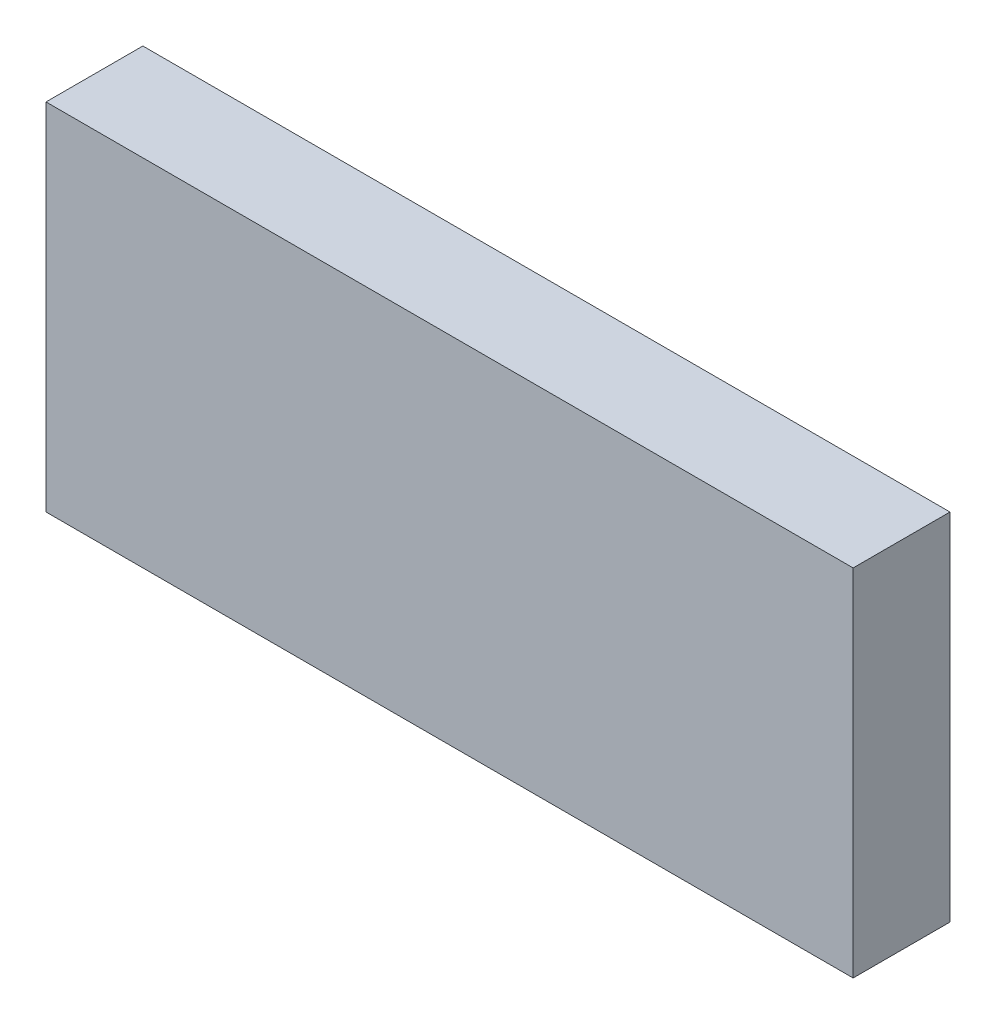
ISO-10303-21;
HEADER;
FILE_DESCRIPTION(('STEP AP214'),'2;1');
FILE_NAME('part.step','',(''),(''),'','','');
FILE_SCHEMA(('AUTOMOTIVE_DESIGN { 1 0 10303 214 1 1 1 1 }'));
ENDSEC;
DATA;
#1=APPLICATION_CONTEXT('core data for automotive mechanical design processes');
#2=APPLICATION_PROTOCOL_DEFINITION('international standard','automotive_design',2000,#1);
#3=PRODUCT_CONTEXT('',#1,'mechanical');
#4=PRODUCT('Part','Part','',(#3));
#5=PRODUCT_RELATED_PRODUCT_CATEGORY('part','',(#4));
#6=PRODUCT_DEFINITION_FORMATION('','',#4);
#7=PRODUCT_DEFINITION_CONTEXT('part definition',#1,'design');
#8=PRODUCT_DEFINITION('design','',#6,#7);
#9=PRODUCT_DEFINITION_SHAPE('','',#8);
#10=(LENGTH_UNIT() NAMED_UNIT(*) SI_UNIT(.MILLI.,.METRE.));
#11=(NAMED_UNIT(*) PLANE_ANGLE_UNIT() SI_UNIT($,.RADIAN.));
#12=(NAMED_UNIT(*) SI_UNIT($,.STERADIAN.) SOLID_ANGLE_UNIT());
#13=UNCERTAINTY_MEASURE_WITH_UNIT(LENGTH_MEASURE(1.E-05),#10,'distance_accuracy_value','');
#14=(GEOMETRIC_REPRESENTATION_CONTEXT(3) GLOBAL_UNCERTAINTY_ASSIGNED_CONTEXT((#13)) GLOBAL_UNIT_ASSIGNED_CONTEXT((#10,
#11,#12)) REPRESENTATION_CONTEXT('',''));
#15=CARTESIAN_POINT('',(0.,0.,0.));
#16=DIRECTION('',(0.,0.,1.));
#17=DIRECTION('',(1.,0.,0.));
#18=AXIS2_PLACEMENT_3D('',#15,#16,#17);
#19=CARTESIAN_POINT('',(0.,0.,6.));
#20=DIRECTION('',(-1.,0.,0.));
#21=DIRECTION('',(0.,0.,1.));
#22=AXIS2_PLACEMENT_3D('',#19,#20,#21);
#23=PLANE('',#22);
#24=DIRECTION('',(0.,1.,0.));
#25=VECTOR('',#24,1.);
#26=CARTESIAN_POINT('',(0.,0.,0.));
#27=LINE('',#26,#25);
#28=CARTESIAN_POINT('',(0.,0.,0.));
#29=VERTEX_POINT('',#28);
#30=CARTESIAN_POINT('',(0.,22.,0.));
#31=VERTEX_POINT('',#30);
#32=EDGE_CURVE('E96',#29,#31,#27,.T.);
#33=ORIENTED_EDGE('',*,*,#32,.T.);
#34=DIRECTION('',(0.,0.,-1.));
#35=VECTOR('',#34,1.);
#36=CARTESIAN_POINT('',(0.,22.,6.));
#37=LINE('',#36,#35);
#38=CARTESIAN_POINT('',(0.,22.,6.));
#39=VERTEX_POINT('',#38);
#40=EDGE_CURVE('E11',#39,#31,#37,.T.);
#41=ORIENTED_EDGE('',*,*,#40,.F.);
#42=DIRECTION('',(0.,1.,0.));
#43=VECTOR('',#42,1.);
#44=CARTESIAN_POINT('',(0.,0.,6.));
#45=LINE('',#44,#43);
#46=CARTESIAN_POINT('',(0.,0.,6.));
#47=VERTEX_POINT('',#46);
#48=EDGE_CURVE('E84',#47,#39,#45,.T.);
#49=ORIENTED_EDGE('',*,*,#48,.F.);
#50=DIRECTION('',(0.,0.,-1.));
#51=VECTOR('',#50,1.);
#52=CARTESIAN_POINT('',(0.,0.,6.));
#53=LINE('',#52,#51);
#54=EDGE_CURVE('E92',#47,#29,#53,.T.);
#55=ORIENTED_EDGE('',*,*,#54,.T.);
#56=EDGE_LOOP('',(#33,#41,#49,#55));
#57=FACE_BOUND('',#56,.T.);
#58=ADVANCED_FACE('F33',(#57),#23,.F.);
#59=CARTESIAN_POINT('',(0.,22.,6.));
#60=DIRECTION('',(0.,-1.,0.));
#61=DIRECTION('',(1.,0.,0.));
#62=AXIS2_PLACEMENT_3D('',#59,#60,#61);
#63=PLANE('',#62);
#64=DIRECTION('',(-1.,0.,0.));
#65=VECTOR('',#64,1.);
#66=CARTESIAN_POINT('',(0.,22.,0.));
#67=LINE('',#66,#65);
#68=CARTESIAN_POINT('',(-50.,22.,0.));
#69=VERTEX_POINT('',#68);
#70=EDGE_CURVE('E88',#31,#69,#67,.T.);
#71=ORIENTED_EDGE('',*,*,#70,.T.);
#72=DIRECTION('',(0.,0.,-1.));
#73=VECTOR('',#72,1.);
#74=CARTESIAN_POINT('',(-50.,22.,6.));
#75=LINE('',#74,#73);
#76=CARTESIAN_POINT('',(-50.,22.,6.));
#77=VERTEX_POINT('',#76);
#78=EDGE_CURVE('E41',#77,#69,#75,.T.);
#79=ORIENTED_EDGE('',*,*,#78,.F.);
#80=DIRECTION('',(-1.,0.,0.));
#81=VECTOR('',#80,1.);
#82=CARTESIAN_POINT('',(0.,22.,6.));
#83=LINE('',#82,#81);
#84=EDGE_CURVE('E79',#39,#77,#83,.T.);
#85=ORIENTED_EDGE('',*,*,#84,.F.);
#86=ORIENTED_EDGE('',*,*,#40,.T.);
#87=EDGE_LOOP('',(#71,#79,#85,#86));
#88=FACE_BOUND('',#87,.T.);
#89=ADVANCED_FACE('F87',(#88),#63,.F.);
#90=CARTESIAN_POINT('',(-50.,0.,6.));
#91=DIRECTION('',(1.,0.,0.));
#92=DIRECTION('',(0.,0.,-1.));
#93=AXIS2_PLACEMENT_3D('',#90,#91,#92);
#94=PLANE('',#93);
#95=DIRECTION('',(0.,-1.,0.));
#96=VECTOR('',#95,1.);
#97=CARTESIAN_POINT('',(-50.,0.,0.));
#98=LINE('',#97,#96);
#99=CARTESIAN_POINT('',(-50.,0.,0.));
#100=VERTEX_POINT('',#99);
#101=EDGE_CURVE('E66',#69,#100,#98,.T.);
#102=ORIENTED_EDGE('',*,*,#101,.T.);
#103=DIRECTION('',(0.,0.,-1.));
#104=VECTOR('',#103,1.);
#105=CARTESIAN_POINT('',(-50.,0.,6.));
#106=LINE('',#105,#104);
#107=CARTESIAN_POINT('',(-50.,0.,6.));
#108=VERTEX_POINT('',#107);
#109=EDGE_CURVE('E89',#108,#100,#106,.T.);
#110=ORIENTED_EDGE('',*,*,#109,.F.);
#111=DIRECTION('',(0.,-1.,0.));
#112=VECTOR('',#111,1.);
#113=CARTESIAN_POINT('',(-50.,0.,6.));
#114=LINE('',#113,#112);
#115=EDGE_CURVE('E82',#77,#108,#114,.T.);
#116=ORIENTED_EDGE('',*,*,#115,.F.);
#117=ORIENTED_EDGE('',*,*,#78,.T.);
#118=EDGE_LOOP('',(#102,#110,#116,#117));
#119=FACE_BOUND('',#118,.T.);
#120=ADVANCED_FACE('F90',(#119),#94,.F.);
#121=CARTESIAN_POINT('',(0.,0.,6.));
#122=DIRECTION('',(0.,1.,0.));
#123=DIRECTION('',(-1.,0.,0.));
#124=AXIS2_PLACEMENT_3D('',#121,#122,#123);
#125=PLANE('',#124);
#126=DIRECTION('',(1.,0.,0.));
#127=VECTOR('',#126,1.);
#128=CARTESIAN_POINT('',(0.,0.,0.));
#129=LINE('',#128,#127);
#130=EDGE_CURVE('E72',#100,#29,#129,.T.);
#131=ORIENTED_EDGE('',*,*,#130,.T.);
#132=ORIENTED_EDGE('',*,*,#54,.F.);
#133=DIRECTION('',(1.,0.,0.));
#134=VECTOR('',#133,1.);
#135=CARTESIAN_POINT('',(0.,0.,6.));
#136=LINE('',#135,#134);
#137=EDGE_CURVE('E49',#108,#47,#136,.T.);
#138=ORIENTED_EDGE('',*,*,#137,.F.);
#139=ORIENTED_EDGE('',*,*,#109,.T.);
#140=EDGE_LOOP('',(#131,#132,#138,#139));
#141=FACE_BOUND('',#140,.T.);
#142=ADVANCED_FACE('F103',(#141),#125,.F.);
#143=CARTESIAN_POINT('',(0.,0.,6.));
#144=DIRECTION('',(0.,0.,1.));
#145=DIRECTION('',(1.,0.,0.));
#146=AXIS2_PLACEMENT_3D('',#143,#144,#145);
#147=PLANE('',#146);
#148=ORIENTED_EDGE('',*,*,#48,.T.);
#149=ORIENTED_EDGE('',*,*,#84,.T.);
#150=ORIENTED_EDGE('',*,*,#115,.T.);
#151=ORIENTED_EDGE('',*,*,#137,.T.);
#152=EDGE_LOOP('',(#148,#149,#150,#151));
#153=FACE_BOUND('',#152,.T.);
#154=ADVANCED_FACE('F80',(#153),#147,.T.);
#155=CARTESIAN_POINT('',(0.,0.,0.));
#156=DIRECTION('',(0.,0.,1.));
#157=DIRECTION('',(1.,0.,0.));
#158=AXIS2_PLACEMENT_3D('',#155,#156,#157);
#159=PLANE('',#158);
#160=ORIENTED_EDGE('',*,*,#32,.F.);
#161=ORIENTED_EDGE('',*,*,#130,.F.);
#162=ORIENTED_EDGE('',*,*,#101,.F.);
#163=ORIENTED_EDGE('',*,*,#70,.F.);
#164=EDGE_LOOP('',(#160,#161,#162,#163));
#165=FACE_BOUND('',#164,.T.);
#166=ADVANCED_FACE('F106',(#165),#159,.F.);
#167=CLOSED_SHELL('',(#58,#89,#120,#142,#154,#166));
#168=MANIFOLD_SOLID_BREP('B2',#167);
#169=ADVANCED_BREP_SHAPE_REPRESENTATION('',(#18,#168),#14);
#170=SHAPE_DEFINITION_REPRESENTATION(#9,#169);
ENDSEC;
END-ISO-10303-21;
